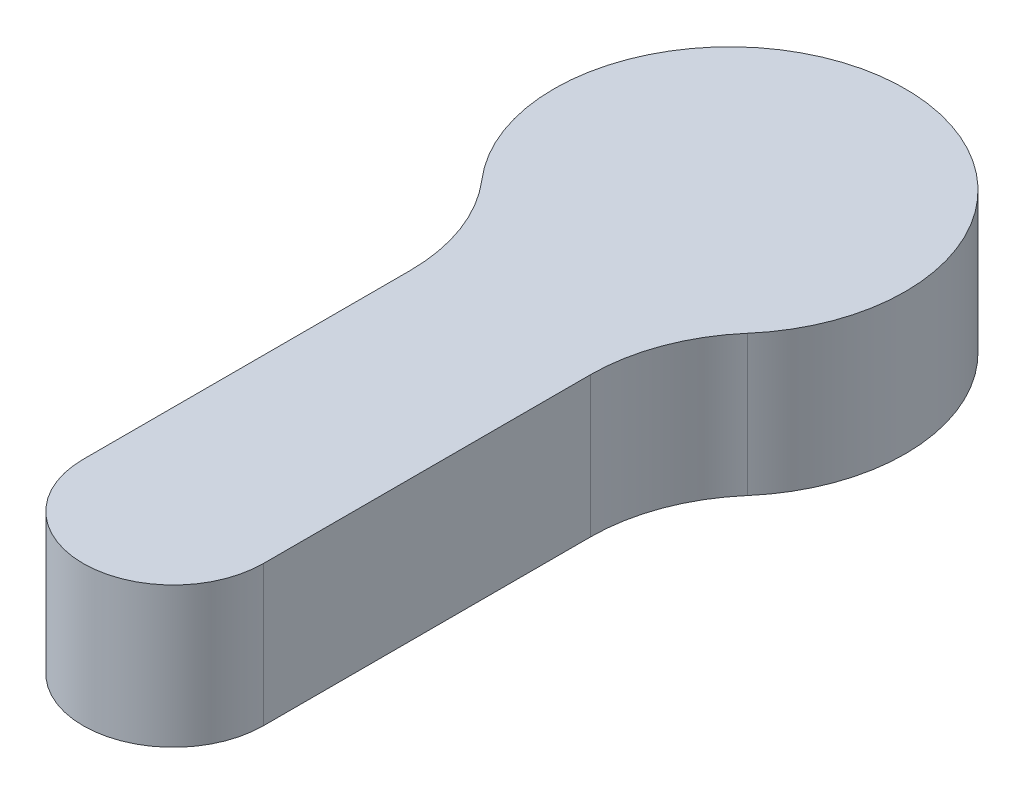
ISO-10303-21;
HEADER;
FILE_DESCRIPTION(('STEP AP214'),'2;1');
FILE_NAME('part.step','',(''),(''),'','','');
FILE_SCHEMA(('AUTOMOTIVE_DESIGN { 1 0 10303 214 1 1 1 1 }'));
ENDSEC;
DATA;
#1=APPLICATION_CONTEXT('core data for automotive mechanical design processes');
#2=APPLICATION_PROTOCOL_DEFINITION('international standard','automotive_design',2000,#1);
#3=PRODUCT_CONTEXT('',#1,'mechanical');
#4=PRODUCT('Part','Part','',(#3));
#5=PRODUCT_RELATED_PRODUCT_CATEGORY('part','',(#4));
#6=PRODUCT_DEFINITION_FORMATION('','',#4);
#7=PRODUCT_DEFINITION_CONTEXT('part definition',#1,'design');
#8=PRODUCT_DEFINITION('design','',#6,#7);
#9=PRODUCT_DEFINITION_SHAPE('','',#8);
#10=(LENGTH_UNIT() NAMED_UNIT(*) SI_UNIT(.MILLI.,.METRE.));
#11=(NAMED_UNIT(*) PLANE_ANGLE_UNIT() SI_UNIT($,.RADIAN.));
#12=(NAMED_UNIT(*) SI_UNIT($,.STERADIAN.) SOLID_ANGLE_UNIT());
#13=UNCERTAINTY_MEASURE_WITH_UNIT(LENGTH_MEASURE(1.E-05),#10,'distance_accuracy_value','');
#14=(GEOMETRIC_REPRESENTATION_CONTEXT(3) GLOBAL_UNCERTAINTY_ASSIGNED_CONTEXT((#13)) GLOBAL_UNIT_ASSIGNED_CONTEXT((#10,
#11,#12)) REPRESENTATION_CONTEXT('',''));
#15=CARTESIAN_POINT('',(0.,0.,0.));
#16=DIRECTION('',(0.,0.,1.));
#17=DIRECTION('',(1.,0.,0.));
#18=AXIS2_PLACEMENT_3D('',#15,#16,#17);
#19=CARTESIAN_POINT('',(0.,5.9182,13.7655964418856));
#20=DIRECTION('',(0.,-1.,0.));
#21=DIRECTION('',(0.,0.,-1.));
#22=AXIS2_PLACEMENT_3D('',#19,#20,#21);
#23=CYLINDRICAL_SURFACE('',#22,3.7973);
#24=CARTESIAN_POINT('',(0.,0.,13.7655964418856));
#25=DIRECTION('',(0.,1.,0.));
#26=DIRECTION('',(0.,0.,1.));
#27=AXIS2_PLACEMENT_3D('',#24,#25,#26);
#28=CIRCLE('',#27,3.7973);
#29=CARTESIAN_POINT('',(-3.7973,0.,13.7655964418856));
#30=VERTEX_POINT('',#29);
#31=CARTESIAN_POINT('',(3.7973,0.,13.7655964418856));
#32=VERTEX_POINT('',#31);
#33=EDGE_CURVE('E131',#30,#32,#28,.T.);
#34=ORIENTED_EDGE('',*,*,#33,.T.);
#35=DIRECTION('',(0.,-1.,0.));
#36=VECTOR('',#35,1.);
#37=CARTESIAN_POINT('',(3.7973,5.9182,13.7655964418856));
#38=LINE('',#37,#36);
#39=CARTESIAN_POINT('',(3.7973,5.9182,13.7655964418856));
#40=VERTEX_POINT('',#39);
#41=EDGE_CURVE('E11',#40,#32,#38,.T.);
#42=ORIENTED_EDGE('',*,*,#41,.F.);
#43=CARTESIAN_POINT('',(0.,5.9182,13.7655964418856));
#44=DIRECTION('',(0.,1.,0.));
#45=DIRECTION('',(0.,0.,1.));
#46=AXIS2_PLACEMENT_3D('',#43,#44,#45);
#47=CIRCLE('',#46,3.7973);
#48=CARTESIAN_POINT('',(-3.7973,5.9182,13.7655964418856));
#49=VERTEX_POINT('',#48);
#50=EDGE_CURVE('E147',#49,#40,#47,.T.);
#51=ORIENTED_EDGE('',*,*,#50,.F.);
#52=DIRECTION('',(0.,-1.,0.));
#53=VECTOR('',#52,1.);
#54=CARTESIAN_POINT('',(-3.7973,5.9182,13.7655964418856));
#55=LINE('',#54,#53);
#56=EDGE_CURVE('E127',#49,#30,#55,.T.);
#57=ORIENTED_EDGE('',*,*,#56,.T.);
#58=EDGE_LOOP('',(#34,#42,#51,#57));
#59=FACE_BOUND('',#58,.T.);
#60=ADVANCED_FACE('F42',(#59),#23,.T.);
#61=CARTESIAN_POINT('',(3.7973,5.9182,13.7655964418856));
#62=DIRECTION('',(-1.,0.,0.));
#63=DIRECTION('',(0.,0.,1.));
#64=AXIS2_PLACEMENT_3D('',#61,#62,#63);
#65=PLANE('',#64);
#66=DIRECTION('',(0.,0.,-1.));
#67=VECTOR('',#66,1.);
#68=CARTESIAN_POINT('',(3.7973,0.,13.7655964418856));
#69=LINE('',#68,#67);
#70=CARTESIAN_POINT('',(3.7973,0.,0.));
#71=VERTEX_POINT('',#70);
#72=EDGE_CURVE('E135',#32,#71,#69,.T.);
#73=ORIENTED_EDGE('',*,*,#72,.T.);
#74=DIRECTION('',(0.,-1.,0.));
#75=VECTOR('',#74,1.);
#76=CARTESIAN_POINT('',(3.7973,5.9182,0.));
#77=LINE('',#76,#75);
#78=CARTESIAN_POINT('',(3.7973,5.9182,0.));
#79=VERTEX_POINT('',#78);
#80=EDGE_CURVE('E51',#79,#71,#77,.T.);
#81=ORIENTED_EDGE('',*,*,#80,.F.);
#82=DIRECTION('',(0.,0.,-1.));
#83=VECTOR('',#82,1.);
#84=CARTESIAN_POINT('',(3.7973,5.9182,13.7655964418856));
#85=LINE('',#84,#83);
#86=EDGE_CURVE('E96',#40,#79,#85,.T.);
#87=ORIENTED_EDGE('',*,*,#86,.F.);
#88=ORIENTED_EDGE('',*,*,#41,.T.);
#89=EDGE_LOOP('',(#73,#81,#87,#88));
#90=FACE_BOUND('',#89,.T.);
#91=ADVANCED_FACE('F175',(#90),#65,.F.);
#92=CARTESIAN_POINT('',(11.1633,5.9182,0.));
#93=DIRECTION('',(0.,-1.,0.));
#94=DIRECTION('',(0.,0.,-1.));
#95=AXIS2_PLACEMENT_3D('',#92,#93,#94);
#96=CYLINDRICAL_SURFACE('',#95,7.366);
#97=CARTESIAN_POINT('',(11.1633,0.,0.));
#98=DIRECTION('',(0.,-1.,0.));
#99=DIRECTION('',(0.,0.,-1.));
#100=AXIS2_PLACEMENT_3D('',#97,#98,#99);
#101=CIRCLE('',#100,7.366);
#102=CARTESIAN_POINT('',(5.59332859773247,0.,-4.8201010962346));
#103=VERTEX_POINT('',#102);
#104=EDGE_CURVE('E138',#71,#103,#101,.T.);
#105=ORIENTED_EDGE('',*,*,#104,.T.);
#106=DIRECTION('',(0.,-1.,0.));
#107=VECTOR('',#106,1.);
#108=CARTESIAN_POINT('',(5.59332859773247,5.9182,-4.8201010962346));
#109=LINE('',#108,#107);
#110=CARTESIAN_POINT('',(5.59332859773247,5.9182,-4.8201010962346));
#111=VERTEX_POINT('',#110);
#112=EDGE_CURVE('E120',#111,#103,#109,.T.);
#113=ORIENTED_EDGE('',*,*,#112,.F.);
#114=CARTESIAN_POINT('',(11.1633,5.9182,0.));
#115=DIRECTION('',(0.,-1.,0.));
#116=DIRECTION('',(0.,0.,-1.));
#117=AXIS2_PLACEMENT_3D('',#114,#115,#116);
#118=CIRCLE('',#117,7.366);
#119=EDGE_CURVE('E109',#79,#111,#118,.T.);
#120=ORIENTED_EDGE('',*,*,#119,.F.);
#121=ORIENTED_EDGE('',*,*,#80,.T.);
#122=EDGE_LOOP('',(#105,#113,#120,#121));
#123=FACE_BOUND('',#122,.T.);
#124=ADVANCED_FACE('F157',(#123),#96,.F.);
#125=CARTESIAN_POINT('',(0.,5.9182,-9.66041487137446));
#126=DIRECTION('',(0.,-1.,0.));
#127=DIRECTION('',(0.,0.,-1.));
#128=AXIS2_PLACEMENT_3D('',#125,#126,#127);
#129=CYLINDRICAL_SURFACE('',#128,7.3968886867399);
#130=CARTESIAN_POINT('',(0.,0.,-9.66041487137446));
#131=DIRECTION('',(0.,1.,0.));
#132=DIRECTION('',(0.,0.,1.));
#133=AXIS2_PLACEMENT_3D('',#130,#131,#132);
#134=CIRCLE('',#133,7.3968886867399);
#135=CARTESIAN_POINT('',(-5.59332859773247,0.,-4.8201010962346));
#136=VERTEX_POINT('',#135);
#137=EDGE_CURVE('E118',#103,#136,#134,.T.);
#138=ORIENTED_EDGE('',*,*,#137,.T.);
#139=DIRECTION('',(0.,-1.,0.));
#140=VECTOR('',#139,1.);
#141=CARTESIAN_POINT('',(-5.59332859773247,5.9182,-4.8201010962346));
#142=LINE('',#141,#140);
#143=CARTESIAN_POINT('',(-5.59332859773247,5.9182,-4.8201010962346));
#144=VERTEX_POINT('',#143);
#145=EDGE_CURVE('E115',#144,#136,#142,.T.);
#146=ORIENTED_EDGE('',*,*,#145,.F.);
#147=CARTESIAN_POINT('',(0.,5.9182,-9.66041487137446));
#148=DIRECTION('',(0.,1.,0.));
#149=DIRECTION('',(0.,0.,1.));
#150=AXIS2_PLACEMENT_3D('',#147,#148,#149);
#151=CIRCLE('',#150,7.3968886867399);
#152=EDGE_CURVE('E103',#111,#144,#151,.T.);
#153=ORIENTED_EDGE('',*,*,#152,.F.);
#154=ORIENTED_EDGE('',*,*,#112,.T.);
#155=EDGE_LOOP('',(#138,#146,#153,#154));
#156=FACE_BOUND('',#155,.T.);
#157=ADVANCED_FACE('F116',(#156),#129,.T.);
#158=CARTESIAN_POINT('',(-11.1633,5.9182,0.));
#159=DIRECTION('',(0.,-1.,0.));
#160=DIRECTION('',(0.,0.,-1.));
#161=AXIS2_PLACEMENT_3D('',#158,#159,#160);
#162=CYLINDRICAL_SURFACE('',#161,7.366);
#163=CARTESIAN_POINT('',(-11.1633,0.,0.));
#164=DIRECTION('',(0.,-1.,0.));
#165=DIRECTION('',(0.,0.,1.));
#166=AXIS2_PLACEMENT_3D('',#163,#164,#165);
#167=CIRCLE('',#166,7.366);
#168=CARTESIAN_POINT('',(-3.7973,0.,0.));
#169=VERTEX_POINT('',#168);
#170=EDGE_CURVE('E82',#136,#169,#167,.T.);
#171=ORIENTED_EDGE('',*,*,#170,.T.);
#172=DIRECTION('',(0.,-1.,0.));
#173=VECTOR('',#172,1.);
#174=CARTESIAN_POINT('',(-3.7973,5.9182,0.));
#175=LINE('',#174,#173);
#176=CARTESIAN_POINT('',(-3.7973,5.9182,0.));
#177=VERTEX_POINT('',#176);
#178=EDGE_CURVE('E121',#177,#169,#175,.T.);
#179=ORIENTED_EDGE('',*,*,#178,.F.);
#180=CARTESIAN_POINT('',(-11.1633,5.9182,0.));
#181=DIRECTION('',(0.,-1.,0.));
#182=DIRECTION('',(0.,0.,1.));
#183=AXIS2_PLACEMENT_3D('',#180,#181,#182);
#184=CIRCLE('',#183,7.366);
#185=EDGE_CURVE('E107',#144,#177,#184,.T.);
#186=ORIENTED_EDGE('',*,*,#185,.F.);
#187=ORIENTED_EDGE('',*,*,#145,.T.);
#188=EDGE_LOOP('',(#171,#179,#186,#187));
#189=FACE_BOUND('',#188,.T.);
#190=ADVANCED_FACE('F123',(#189),#162,.F.);
#191=CARTESIAN_POINT('',(-3.7973,5.9182,13.7655964418856));
#192=DIRECTION('',(1.,0.,0.));
#193=DIRECTION('',(0.,0.,-1.));
#194=AXIS2_PLACEMENT_3D('',#191,#192,#193);
#195=PLANE('',#194);
#196=DIRECTION('',(0.,0.,1.));
#197=VECTOR('',#196,1.);
#198=CARTESIAN_POINT('',(-3.7973,0.,13.7655964418856));
#199=LINE('',#198,#197);
#200=EDGE_CURVE('E88',#169,#30,#199,.T.);
#201=ORIENTED_EDGE('',*,*,#200,.T.);
#202=ORIENTED_EDGE('',*,*,#56,.F.);
#203=DIRECTION('',(0.,0.,1.));
#204=VECTOR('',#203,1.);
#205=CARTESIAN_POINT('',(-3.7973,5.9182,13.7655964418856));
#206=LINE('',#205,#204);
#207=EDGE_CURVE('E59',#177,#49,#206,.T.);
#208=ORIENTED_EDGE('',*,*,#207,.F.);
#209=ORIENTED_EDGE('',*,*,#178,.T.);
#210=EDGE_LOOP('',(#201,#202,#208,#209));
#211=FACE_BOUND('',#210,.T.);
#212=ADVANCED_FACE('F164',(#211),#195,.F.);
#213=CARTESIAN_POINT('',(0.,5.9182,13.7655964418856));
#214=DIRECTION('',(0.,1.,0.));
#215=DIRECTION('',(0.,0.,1.));
#216=AXIS2_PLACEMENT_3D('',#213,#214,#215);
#217=PLANE('',#216);
#218=ORIENTED_EDGE('',*,*,#50,.T.);
#219=ORIENTED_EDGE('',*,*,#86,.T.);
#220=ORIENTED_EDGE('',*,*,#119,.T.);
#221=ORIENTED_EDGE('',*,*,#152,.T.);
#222=ORIENTED_EDGE('',*,*,#185,.T.);
#223=ORIENTED_EDGE('',*,*,#207,.T.);
#224=EDGE_LOOP('',(#218,#219,#220,#221,#222,#223));
#225=FACE_BOUND('',#224,.T.);
#226=ADVANCED_FACE('F105',(#225),#217,.T.);
#227=CARTESIAN_POINT('',(0.,0.,13.7655964418856));
#228=DIRECTION('',(0.,1.,0.));
#229=DIRECTION('',(0.,0.,1.));
#230=AXIS2_PLACEMENT_3D('',#227,#228,#229);
#231=PLANE('',#230);
#232=ORIENTED_EDGE('',*,*,#33,.F.);
#233=ORIENTED_EDGE('',*,*,#200,.F.);
#234=ORIENTED_EDGE('',*,*,#170,.F.);
#235=ORIENTED_EDGE('',*,*,#137,.F.);
#236=ORIENTED_EDGE('',*,*,#104,.F.);
#237=ORIENTED_EDGE('',*,*,#72,.F.);
#238=EDGE_LOOP('',(#232,#233,#234,#235,#236,#237));
#239=FACE_BOUND('',#238,.T.);
#240=ADVANCED_FACE('F160',(#239),#231,.F.);
#241=CLOSED_SHELL('',(#60,#91,#124,#157,#190,#212,#226,#240));
#242=MANIFOLD_SOLID_BREP('B2',#241);
#243=ADVANCED_BREP_SHAPE_REPRESENTATION('',(#18,#242),#14);
#244=SHAPE_DEFINITION_REPRESENTATION(#9,#243);
ENDSEC;
END-ISO-10303-21;
